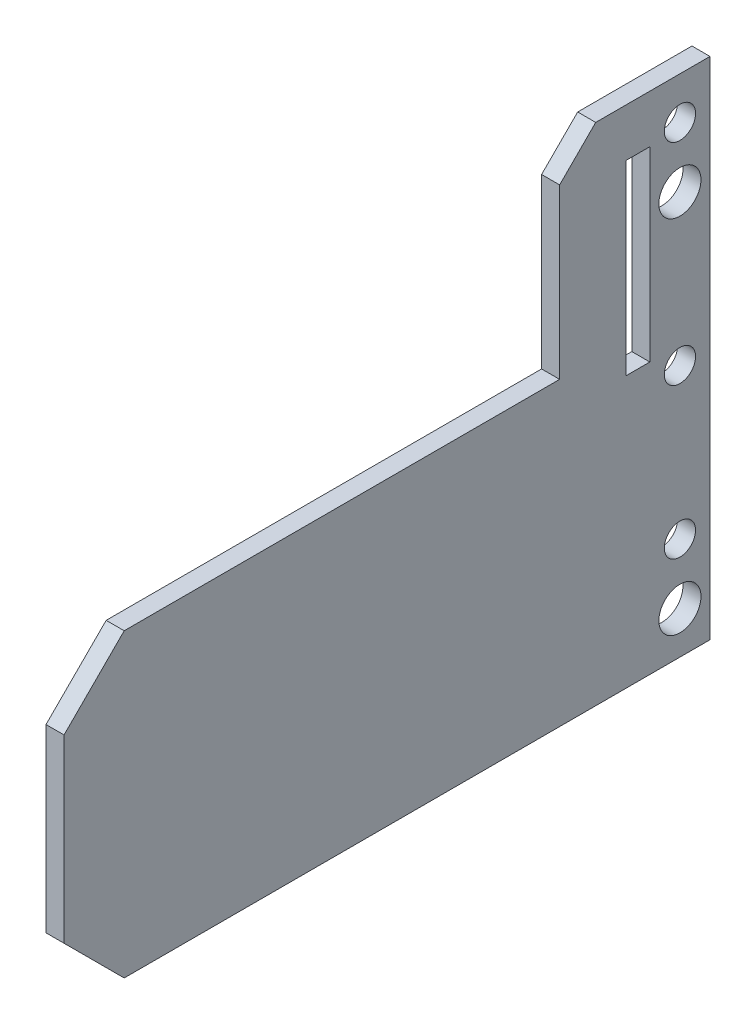
ISO-10303-21;
HEADER;
FILE_DESCRIPTION(('STEP AP214'),'2;1');
FILE_NAME('part.step','',(''),(''),'','','');
FILE_SCHEMA(('AUTOMOTIVE_DESIGN { 1 0 10303 214 1 1 1 1 }'));
ENDSEC;
DATA;
#1=APPLICATION_CONTEXT('core data for automotive mechanical design processes');
#2=APPLICATION_PROTOCOL_DEFINITION('international standard','automotive_design',2000,#1);
#3=PRODUCT_CONTEXT('',#1,'mechanical');
#4=PRODUCT('Part','Part','',(#3));
#5=PRODUCT_RELATED_PRODUCT_CATEGORY('part','',(#4));
#6=PRODUCT_DEFINITION_FORMATION('','',#4);
#7=PRODUCT_DEFINITION_CONTEXT('part definition',#1,'design');
#8=PRODUCT_DEFINITION('design','',#6,#7);
#9=PRODUCT_DEFINITION_SHAPE('','',#8);
#10=(LENGTH_UNIT() NAMED_UNIT(*) SI_UNIT(.MILLI.,.METRE.));
#11=(NAMED_UNIT(*) PLANE_ANGLE_UNIT() SI_UNIT($,.RADIAN.));
#12=(NAMED_UNIT(*) SI_UNIT($,.STERADIAN.) SOLID_ANGLE_UNIT());
#13=UNCERTAINTY_MEASURE_WITH_UNIT(LENGTH_MEASURE(1.E-05),#10,'distance_accuracy_value','');
#14=(GEOMETRIC_REPRESENTATION_CONTEXT(3) GLOBAL_UNCERTAINTY_ASSIGNED_CONTEXT((#13)) GLOBAL_UNIT_ASSIGNED_CONTEXT((#10,
#11,#12)) REPRESENTATION_CONTEXT('',''));
#15=CARTESIAN_POINT('',(0.,0.,0.));
#16=DIRECTION('',(0.,0.,1.));
#17=DIRECTION('',(1.,0.,0.));
#18=AXIS2_PLACEMENT_3D('',#15,#16,#17);
#19=CARTESIAN_POINT('',(1.5,-21.,-2.5000000000001));
#20=DIRECTION('',(-1.,0.,0.));
#21=DIRECTION('',(0.,0.,1.));
#22=AXIS2_PLACEMENT_3D('',#19,#20,#21);
#23=PLANE('',#22);
#24=DIRECTION('',(0.,0.,-1.));
#25=VECTOR('',#24,1.);
#26=CARTESIAN_POINT('',(1.5,17.,2.49999999999945));
#27=LINE('',#26,#25);
#28=CARTESIAN_POINT('',(1.5,17.,4.49999999999945));
#29=VERTEX_POINT('',#28);
#30=CARTESIAN_POINT('',(1.5,17.,2.49999999999945));
#31=VERTEX_POINT('',#30);
#32=EDGE_CURVE('E216',#29,#31,#27,.T.);
#33=ORIENTED_EDGE('',*,*,#32,.T.);
#34=DIRECTION('',(0.,-1.,0.));
#35=VECTOR('',#34,1.);
#36=CARTESIAN_POINT('',(1.5,17.,2.49999999999945));
#37=LINE('',#36,#35);
#38=CARTESIAN_POINT('',(1.5,1.5,2.49999999999945));
#39=VERTEX_POINT('',#38);
#40=EDGE_CURVE('E206',#31,#39,#37,.T.);
#41=ORIENTED_EDGE('',*,*,#40,.T.);
#42=DIRECTION('',(0.,0.,1.));
#43=VECTOR('',#42,1.);
#44=CARTESIAN_POINT('',(1.5,1.5,2.49999999999945));
#45=LINE('',#44,#43);
#46=CARTESIAN_POINT('',(1.5,1.5,4.49999999999945));
#47=VERTEX_POINT('',#46);
#48=EDGE_CURVE('E209',#39,#47,#45,.T.);
#49=ORIENTED_EDGE('',*,*,#48,.T.);
#50=DIRECTION('',(0.,1.,0.));
#51=VECTOR('',#50,1.);
#52=CARTESIAN_POINT('',(1.5,17.,4.49999999999945));
#53=LINE('',#52,#51);
#54=EDGE_CURVE('E213',#47,#29,#53,.T.);
#55=ORIENTED_EDGE('',*,*,#54,.T.);
#56=EDGE_LOOP('',(#33,#41,#49,#55));
#57=FACE_BOUND('',#56,.T.);
#58=CARTESIAN_POINT('',(1.5,17.4999999999999,0.));
#59=DIRECTION('',(1.,0.,0.));
#60=DIRECTION('',(0.,0.,-1.));
#61=AXIS2_PLACEMENT_3D('',#58,#59,#60);
#62=CIRCLE('',#61,1.29999994);
#63=CARTESIAN_POINT('',(1.5,17.4999999999999,-1.29999994));
#64=VERTEX_POINT('',#63);
#65=EDGE_CURVE('E229',#64,#64,#62,.T.);
#66=ORIENTED_EDGE('',*,*,#65,.F.);
#67=EDGE_LOOP('',(#66));
#68=FACE_BOUND('',#67,.T.);
#69=CARTESIAN_POINT('',(1.5,-12.5,0.));
#70=DIRECTION('',(1.,0.,0.));
#71=DIRECTION('',(0.,0.,-1.));
#72=AXIS2_PLACEMENT_3D('',#69,#70,#71);
#73=CIRCLE('',#72,1.29999994);
#74=CARTESIAN_POINT('',(1.5,-12.5,-1.29999994));
#75=VERTEX_POINT('',#74);
#76=EDGE_CURVE('E241',#75,#75,#73,.T.);
#77=ORIENTED_EDGE('',*,*,#76,.F.);
#78=EDGE_LOOP('',(#77));
#79=FACE_BOUND('',#78,.T.);
#80=CARTESIAN_POINT('',(1.5,0.,0.));
#81=DIRECTION('',(1.,0.,0.));
#82=DIRECTION('',(0.,0.,-1.));
#83=AXIS2_PLACEMENT_3D('',#80,#81,#82);
#84=CIRCLE('',#83,1.29999994);
#85=CARTESIAN_POINT('',(1.5,0.,-1.29999994));
#86=VERTEX_POINT('',#85);
#87=EDGE_CURVE('E247',#86,#86,#84,.T.);
#88=ORIENTED_EDGE('',*,*,#87,.F.);
#89=EDGE_LOOP('',(#88));
#90=FACE_BOUND('',#89,.T.);
#91=CARTESIAN_POINT('',(1.5,-17.5,0.));
#92=DIRECTION('',(1.,0.,0.));
#93=DIRECTION('',(0.,0.,-1.));
#94=AXIS2_PLACEMENT_3D('',#91,#92,#93);
#95=CIRCLE('',#94,1.74999999999946);
#96=CARTESIAN_POINT('',(1.5,-17.5,-1.74999999999945));
#97=VERTEX_POINT('',#96);
#98=EDGE_CURVE('E167',#97,#97,#95,.T.);
#99=ORIENTED_EDGE('',*,*,#98,.F.);
#100=EDGE_LOOP('',(#99));
#101=FACE_BOUND('',#100,.T.);
#102=DIRECTION('',(0.,-1.,0.));
#103=VECTOR('',#102,1.);
#104=CARTESIAN_POINT('',(1.5,21.,51.2));
#105=LINE('',#104,#103);
#106=CARTESIAN_POINT('',(1.5,-0.999999999999972,51.2));
#107=VERTEX_POINT('',#106);
#108=CARTESIAN_POINT('',(1.5,-16.,51.2));
#109=VERTEX_POINT('',#108);
#110=EDGE_CURVE('E159',#107,#109,#105,.T.);
#111=ORIENTED_EDGE('',*,*,#110,.T.);
#112=DIRECTION('',(0.,0.707106781186548,0.707106781186547));
#113=VECTOR('',#112,1.);
#114=CARTESIAN_POINT('',(1.5,-21.,46.2));
#115=LINE('',#114,#113);
#116=CARTESIAN_POINT('',(1.5,-21.,46.2));
#117=VERTEX_POINT('',#116);
#118=EDGE_CURVE('E127',#117,#109,#115,.T.);
#119=ORIENTED_EDGE('',*,*,#118,.F.);
#120=DIRECTION('',(0.,0.,-1.));
#121=VECTOR('',#120,1.);
#122=CARTESIAN_POINT('',(1.5,-21.,-2.5000000000001));
#123=LINE('',#122,#121);
#124=CARTESIAN_POINT('',(1.5,-21.,-2.5000000000001));
#125=VERTEX_POINT('',#124);
#126=EDGE_CURVE('E154',#117,#125,#123,.T.);
#127=ORIENTED_EDGE('',*,*,#126,.T.);
#128=DIRECTION('',(0.,1.,0.));
#129=VECTOR('',#128,1.);
#130=CARTESIAN_POINT('',(1.5,21.,-2.50000000000005));
#131=LINE('',#130,#129);
#132=CARTESIAN_POINT('',(1.5,21.,-2.50000000000005));
#133=VERTEX_POINT('',#132);
#134=EDGE_CURVE('E147',#125,#133,#131,.T.);
#135=ORIENTED_EDGE('',*,*,#134,.T.);
#136=DIRECTION('',(0.,0.,1.));
#137=VECTOR('',#136,1.);
#138=CARTESIAN_POINT('',(1.5,21.,-2.50000000000005));
#139=LINE('',#138,#137);
#140=CARTESIAN_POINT('',(1.5,21.,7.));
#141=VERTEX_POINT('',#140);
#142=EDGE_CURVE('E164',#133,#141,#139,.T.);
#143=ORIENTED_EDGE('',*,*,#142,.T.);
#144=DIRECTION('',(0.,0.707106781186544,-0.707106781186551));
#145=VECTOR('',#144,1.);
#146=CARTESIAN_POINT('',(1.5,18.0000000000001,10.));
#147=LINE('',#146,#145);
#148=CARTESIAN_POINT('',(1.5,18.0000000000001,10.));
#149=VERTEX_POINT('',#148);
#150=EDGE_CURVE('E185',#149,#141,#147,.T.);
#151=ORIENTED_EDGE('',*,*,#150,.F.);
#152=DIRECTION('',(0.,1.,0.));
#153=VECTOR('',#152,1.);
#154=CARTESIAN_POINT('',(1.5,4.00000000000003,10.));
#155=LINE('',#154,#153);
#156=CARTESIAN_POINT('',(1.5,4.00000000000003,10.));
#157=VERTEX_POINT('',#156);
#158=EDGE_CURVE('E473',#157,#149,#155,.T.);
#159=ORIENTED_EDGE('',*,*,#158,.F.);
#160=DIRECTION('',(0.,0.,-1.));
#161=VECTOR('',#160,1.);
#162=CARTESIAN_POINT('',(1.5,4.00000000000003,46.2));
#163=LINE('',#162,#161);
#164=CARTESIAN_POINT('',(1.5,4.00000000000003,46.2));
#165=VERTEX_POINT('',#164);
#166=EDGE_CURVE('E470',#165,#157,#163,.T.);
#167=ORIENTED_EDGE('',*,*,#166,.F.);
#168=DIRECTION('',(0.,0.707106781186548,-0.707106781186547));
#169=VECTOR('',#168,1.);
#170=CARTESIAN_POINT('',(1.5,4.00000000000003,46.2));
#171=LINE('',#170,#169);
#172=EDGE_CURVE('E467',#107,#165,#171,.T.);
#173=ORIENTED_EDGE('',*,*,#172,.F.);
#174=EDGE_LOOP('',(#111,#119,#127,#135,#143,#151,#159,#167,#173));
#175=FACE_BOUND('',#174,.T.);
#176=CARTESIAN_POINT('',(1.5,12.5,2.95125035520982E-13));
#177=DIRECTION('',(1.,0.,0.));
#178=DIRECTION('',(0.,0.,-1.));
#179=AXIS2_PLACEMENT_3D('',#176,#177,#178);
#180=CIRCLE('',#179,1.75);
#181=CARTESIAN_POINT('',(1.5,12.5,-1.7499999999997));
#182=VERTEX_POINT('',#181);
#183=EDGE_CURVE('E175',#182,#182,#180,.T.);
#184=ORIENTED_EDGE('',*,*,#183,.F.);
#185=EDGE_LOOP('',(#184));
#186=FACE_BOUND('',#185,.T.);
#187=ADVANCED_FACE('F30',(#57,#68,#79,#90,#101,#175,#186),#23,.F.);
#188=CARTESIAN_POINT('',(0.,-21.,-2.5000000000001));
#189=DIRECTION('',(-1.,0.,0.));
#190=DIRECTION('',(0.,0.,1.));
#191=AXIS2_PLACEMENT_3D('',#188,#189,#190);
#192=PLANE('',#191);
#193=DIRECTION('',(0.,0.707106781186548,0.707106781186547));
#194=VECTOR('',#193,1.);
#195=CARTESIAN_POINT('',(0.,-21.,46.2));
#196=LINE('',#195,#194);
#197=CARTESIAN_POINT('',(0.,-21.,46.2));
#198=VERTEX_POINT('',#197);
#199=CARTESIAN_POINT('',(0.,-16.,51.2));
#200=VERTEX_POINT('',#199);
#201=EDGE_CURVE('E45',#198,#200,#196,.T.);
#202=ORIENTED_EDGE('',*,*,#201,.T.);
#203=DIRECTION('',(0.,-1.,0.));
#204=VECTOR('',#203,1.);
#205=CARTESIAN_POINT('',(0.,21.,51.2));
#206=LINE('',#205,#204);
#207=CARTESIAN_POINT('',(0.,-0.99999999999997,51.2));
#208=VERTEX_POINT('',#207);
#209=EDGE_CURVE('E139',#208,#200,#206,.T.);
#210=ORIENTED_EDGE('',*,*,#209,.F.);
#211=DIRECTION('',(0.,0.707106781186548,-0.707106781186547));
#212=VECTOR('',#211,1.);
#213=CARTESIAN_POINT('',(0.,4.00000000000003,46.2));
#214=LINE('',#213,#212);
#215=CARTESIAN_POINT('',(0.,4.00000000000003,46.2));
#216=VERTEX_POINT('',#215);
#217=EDGE_CURVE('E53',#208,#216,#214,.T.);
#218=ORIENTED_EDGE('',*,*,#217,.T.);
#219=DIRECTION('',(0.,0.,-1.));
#220=VECTOR('',#219,1.);
#221=CARTESIAN_POINT('',(0.,4.00000000000003,46.2));
#222=LINE('',#221,#220);
#223=CARTESIAN_POINT('',(0.,4.00000000000003,10.));
#224=VERTEX_POINT('',#223);
#225=EDGE_CURVE('E483',#216,#224,#222,.T.);
#226=ORIENTED_EDGE('',*,*,#225,.T.);
#227=DIRECTION('',(0.,1.,0.));
#228=VECTOR('',#227,1.);
#229=CARTESIAN_POINT('',(0.,4.00000000000003,10.));
#230=LINE('',#229,#228);
#231=CARTESIAN_POINT('',(0.,18.0000000000001,10.));
#232=VERTEX_POINT('',#231);
#233=EDGE_CURVE('E475',#224,#232,#230,.T.);
#234=ORIENTED_EDGE('',*,*,#233,.T.);
#235=DIRECTION('',(0.,0.707106781186544,-0.707106781186551));
#236=VECTOR('',#235,1.);
#237=CARTESIAN_POINT('',(0.,18.0000000000001,10.));
#238=LINE('',#237,#236);
#239=CARTESIAN_POINT('',(0.,21.,7.));
#240=VERTEX_POINT('',#239);
#241=EDGE_CURVE('E471',#232,#240,#238,.T.);
#242=ORIENTED_EDGE('',*,*,#241,.T.);
#243=DIRECTION('',(0.,0.,1.));
#244=VECTOR('',#243,1.);
#245=CARTESIAN_POINT('',(0.,21.,-2.50000000000005));
#246=LINE('',#245,#244);
#247=CARTESIAN_POINT('',(0.,21.,-2.50000000000005));
#248=VERTEX_POINT('',#247);
#249=EDGE_CURVE('E145',#248,#240,#246,.T.);
#250=ORIENTED_EDGE('',*,*,#249,.F.);
#251=DIRECTION('',(0.,1.,0.));
#252=VECTOR('',#251,1.);
#253=CARTESIAN_POINT('',(0.,21.,-2.50000000000005));
#254=LINE('',#253,#252);
#255=CARTESIAN_POINT('',(0.,-21.,-2.5000000000001));
#256=VERTEX_POINT('',#255);
#257=EDGE_CURVE('E150',#256,#248,#254,.T.);
#258=ORIENTED_EDGE('',*,*,#257,.F.);
#259=DIRECTION('',(0.,0.,-1.));
#260=VECTOR('',#259,1.);
#261=CARTESIAN_POINT('',(0.,-21.,-2.5000000000001));
#262=LINE('',#261,#260);
#263=EDGE_CURVE('E141',#198,#256,#262,.T.);
#264=ORIENTED_EDGE('',*,*,#263,.F.);
#265=EDGE_LOOP('',(#202,#210,#218,#226,#234,#242,#250,#258,#264));
#266=FACE_BOUND('',#265,.T.);
#267=DIRECTION('',(0.,-1.,0.));
#268=VECTOR('',#267,1.);
#269=CARTESIAN_POINT('',(0.,17.,2.49999999999945));
#270=LINE('',#269,#268);
#271=CARTESIAN_POINT('',(0.,17.,2.49999999999945));
#272=VERTEX_POINT('',#271);
#273=CARTESIAN_POINT('',(0.,1.5,2.49999999999945));
#274=VERTEX_POINT('',#273);
#275=EDGE_CURVE('E192',#272,#274,#270,.T.);
#276=ORIENTED_EDGE('',*,*,#275,.F.);
#277=DIRECTION('',(0.,0.,-1.));
#278=VECTOR('',#277,1.);
#279=CARTESIAN_POINT('',(0.,17.,2.49999999999945));
#280=LINE('',#279,#278);
#281=CARTESIAN_POINT('',(0.,17.,4.49999999999945));
#282=VERTEX_POINT('',#281);
#283=EDGE_CURVE('E210',#282,#272,#280,.T.);
#284=ORIENTED_EDGE('',*,*,#283,.F.);
#285=DIRECTION('',(0.,1.,0.));
#286=VECTOR('',#285,1.);
#287=CARTESIAN_POINT('',(0.,17.,4.49999999999945));
#288=LINE('',#287,#286);
#289=CARTESIAN_POINT('',(0.,1.5,4.49999999999945));
#290=VERTEX_POINT('',#289);
#291=EDGE_CURVE('E222',#290,#282,#288,.T.);
#292=ORIENTED_EDGE('',*,*,#291,.F.);
#293=DIRECTION('',(0.,0.,1.));
#294=VECTOR('',#293,1.);
#295=CARTESIAN_POINT('',(0.,1.5,2.49999999999945));
#296=LINE('',#295,#294);
#297=EDGE_CURVE('E195',#274,#290,#296,.T.);
#298=ORIENTED_EDGE('',*,*,#297,.F.);
#299=EDGE_LOOP('',(#276,#284,#292,#298));
#300=FACE_BOUND('',#299,.T.);
#301=CARTESIAN_POINT('',(0.,17.4999999999999,0.));
#302=DIRECTION('',(1.,0.,0.));
#303=DIRECTION('',(0.,0.,-1.));
#304=AXIS2_PLACEMENT_3D('',#301,#302,#303);
#305=CIRCLE('',#304,1.29999994);
#306=CARTESIAN_POINT('',(0.,17.4999999999999,-1.29999994));
#307=VERTEX_POINT('',#306);
#308=EDGE_CURVE('E238',#307,#307,#305,.T.);
#309=ORIENTED_EDGE('',*,*,#308,.T.);
#310=EDGE_LOOP('',(#309));
#311=FACE_BOUND('',#310,.T.);
#312=CARTESIAN_POINT('',(0.,-12.5,0.));
#313=DIRECTION('',(1.,0.,0.));
#314=DIRECTION('',(0.,0.,-1.));
#315=AXIS2_PLACEMENT_3D('',#312,#313,#314);
#316=CIRCLE('',#315,1.29999994);
#317=CARTESIAN_POINT('',(0.,-12.5,-1.29999994));
#318=VERTEX_POINT('',#317);
#319=EDGE_CURVE('E244',#318,#318,#316,.T.);
#320=ORIENTED_EDGE('',*,*,#319,.T.);
#321=EDGE_LOOP('',(#320));
#322=FACE_BOUND('',#321,.T.);
#323=CARTESIAN_POINT('',(0.,0.,0.));
#324=DIRECTION('',(1.,0.,0.));
#325=DIRECTION('',(0.,0.,-1.));
#326=AXIS2_PLACEMENT_3D('',#323,#324,#325);
#327=CIRCLE('',#326,1.29999994);
#328=CARTESIAN_POINT('',(0.,0.,-1.29999994));
#329=VERTEX_POINT('',#328);
#330=EDGE_CURVE('E250',#329,#329,#327,.T.);
#331=ORIENTED_EDGE('',*,*,#330,.T.);
#332=EDGE_LOOP('',(#331));
#333=FACE_BOUND('',#332,.T.);
#334=CARTESIAN_POINT('',(0.,-17.5,0.));
#335=DIRECTION('',(1.,0.,0.));
#336=DIRECTION('',(0.,0.,-1.));
#337=AXIS2_PLACEMENT_3D('',#334,#335,#336);
#338=CIRCLE('',#337,1.74999999999946);
#339=CARTESIAN_POINT('',(0.,-17.5,-1.74999999999945));
#340=VERTEX_POINT('',#339);
#341=EDGE_CURVE('E170',#340,#340,#338,.T.);
#342=ORIENTED_EDGE('',*,*,#341,.T.);
#343=EDGE_LOOP('',(#342));
#344=FACE_BOUND('',#343,.T.);
#345=CARTESIAN_POINT('',(0.,12.5,2.95125035520982E-13));
#346=DIRECTION('',(1.,0.,0.));
#347=DIRECTION('',(0.,0.,-1.));
#348=AXIS2_PLACEMENT_3D('',#345,#346,#347);
#349=CIRCLE('',#348,1.75);
#350=CARTESIAN_POINT('',(0.,12.5,-1.7499999999997));
#351=VERTEX_POINT('',#350);
#352=EDGE_CURVE('E178',#351,#351,#349,.T.);
#353=ORIENTED_EDGE('',*,*,#352,.T.);
#354=EDGE_LOOP('',(#353));
#355=FACE_BOUND('',#354,.T.);
#356=ADVANCED_FACE('F137',(#266,#300,#311,#322,#333,#344,#355),#192,.T.);
#357=CARTESIAN_POINT('',(1.5,21.,-2.50000000000005));
#358=DIRECTION('',(0.,0.,1.));
#359=DIRECTION('',(0.,-1.,0.));
#360=AXIS2_PLACEMENT_3D('',#357,#358,#359);
#361=PLANE('',#360);
#362=ORIENTED_EDGE('',*,*,#257,.T.);
#363=DIRECTION('',(-1.,0.,0.));
#364=VECTOR('',#363,1.);
#365=CARTESIAN_POINT('',(1.5,21.,-2.50000000000005));
#366=LINE('',#365,#364);
#367=EDGE_CURVE('E11',#133,#248,#366,.T.);
#368=ORIENTED_EDGE('',*,*,#367,.F.);
#369=ORIENTED_EDGE('',*,*,#134,.F.);
#370=DIRECTION('',(-1.,0.,0.));
#371=VECTOR('',#370,1.);
#372=CARTESIAN_POINT('',(1.5,-21.,-2.5000000000001));
#373=LINE('',#372,#371);
#374=EDGE_CURVE('E38',#125,#256,#373,.T.);
#375=ORIENTED_EDGE('',*,*,#374,.T.);
#376=EDGE_LOOP('',(#362,#368,#369,#375));
#377=FACE_BOUND('',#376,.T.);
#378=ADVANCED_FACE('F32',(#377),#361,.F.);
#379=CARTESIAN_POINT('',(1.5,21.,-2.50000000000005));
#380=DIRECTION('',(0.,-1.,0.));
#381=DIRECTION('',(0.,0.,-1.));
#382=AXIS2_PLACEMENT_3D('',#379,#380,#381);
#383=PLANE('',#382);
#384=ORIENTED_EDGE('',*,*,#249,.T.);
#385=DIRECTION('',(1.,0.,0.));
#386=VECTOR('',#385,1.);
#387=CARTESIAN_POINT('',(-0.000999999999999916,21.,7.));
#388=LINE('',#387,#386);
#389=EDGE_CURVE('E189',#240,#141,#388,.T.);
#390=ORIENTED_EDGE('',*,*,#389,.T.);
#391=ORIENTED_EDGE('',*,*,#142,.F.);
#392=ORIENTED_EDGE('',*,*,#367,.T.);
#393=EDGE_LOOP('',(#384,#390,#391,#392));
#394=FACE_BOUND('',#393,.T.);
#395=ADVANCED_FACE('F188',(#394),#383,.F.);
#396=CARTESIAN_POINT('',(1.5,21.,51.2));
#397=DIRECTION('',(0.,0.,-1.));
#398=DIRECTION('',(0.,1.,0.));
#399=AXIS2_PLACEMENT_3D('',#396,#397,#398);
#400=PLANE('',#399);
#401=ORIENTED_EDGE('',*,*,#209,.T.);
#402=DIRECTION('',(1.,0.,0.));
#403=VECTOR('',#402,1.);
#404=CARTESIAN_POINT('',(-0.000999999999999916,-16.,51.2));
#405=LINE('',#404,#403);
#406=EDGE_CURVE('E124',#200,#109,#405,.T.);
#407=ORIENTED_EDGE('',*,*,#406,.T.);
#408=ORIENTED_EDGE('',*,*,#110,.F.);
#409=DIRECTION('',(1.,0.,0.));
#410=VECTOR('',#409,1.);
#411=CARTESIAN_POINT('',(-0.000999999999999916,-0.999999999999972,51.2));
#412=LINE('',#411,#410);
#413=EDGE_CURVE('E144',#208,#107,#412,.T.);
#414=ORIENTED_EDGE('',*,*,#413,.F.);
#415=EDGE_LOOP('',(#401,#407,#408,#414));
#416=FACE_BOUND('',#415,.T.);
#417=ADVANCED_FACE('F143',(#416),#400,.F.);
#418=CARTESIAN_POINT('',(1.5,-21.,-2.5000000000001));
#419=DIRECTION('',(0.,1.,0.));
#420=DIRECTION('',(0.,0.,1.));
#421=AXIS2_PLACEMENT_3D('',#418,#419,#420);
#422=PLANE('',#421);
#423=ORIENTED_EDGE('',*,*,#126,.F.);
#424=DIRECTION('',(1.,0.,0.));
#425=VECTOR('',#424,1.);
#426=CARTESIAN_POINT('',(-0.000999999999999916,-21.,46.2));
#427=LINE('',#426,#425);
#428=EDGE_CURVE('E132',#198,#117,#427,.T.);
#429=ORIENTED_EDGE('',*,*,#428,.F.);
#430=ORIENTED_EDGE('',*,*,#263,.T.);
#431=ORIENTED_EDGE('',*,*,#374,.F.);
#432=EDGE_LOOP('',(#423,#429,#430,#431));
#433=FACE_BOUND('',#432,.T.);
#434=ADVANCED_FACE('F271',(#433),#422,.F.);
#435=CARTESIAN_POINT('',(1.5,-17.5,0.));
#436=DIRECTION('',(-1.,0.,0.));
#437=DIRECTION('',(0.,0.,1.));
#438=AXIS2_PLACEMENT_3D('',#435,#436,#437);
#439=CYLINDRICAL_SURFACE('',#438,1.74999999999946);
#440=ORIENTED_EDGE('',*,*,#98,.T.);
#441=EDGE_LOOP('',(#440));
#442=FACE_BOUND('',#441,.T.);
#443=ORIENTED_EDGE('',*,*,#341,.F.);
#444=EDGE_LOOP('',(#443));
#445=FACE_BOUND('',#444,.T.);
#446=ADVANCED_FACE('F262',(#442,#445),#439,.F.);
#447=CARTESIAN_POINT('',(1.5,12.5,2.95125035520982E-13));
#448=DIRECTION('',(-1.,0.,0.));
#449=DIRECTION('',(0.,0.,1.));
#450=AXIS2_PLACEMENT_3D('',#447,#448,#449);
#451=CYLINDRICAL_SURFACE('',#450,1.75);
#452=ORIENTED_EDGE('',*,*,#183,.T.);
#453=EDGE_LOOP('',(#452));
#454=FACE_BOUND('',#453,.T.);
#455=ORIENTED_EDGE('',*,*,#352,.F.);
#456=EDGE_LOOP('',(#455));
#457=FACE_BOUND('',#456,.T.);
#458=ADVANCED_FACE('F259',(#454,#457),#451,.F.);
#459=CARTESIAN_POINT('',(1.5,0.,0.));
#460=DIRECTION('',(1.,0.,0.));
#461=DIRECTION('',(0.,0.,-1.));
#462=AXIS2_PLACEMENT_3D('',#459,#460,#461);
#463=CYLINDRICAL_SURFACE('',#462,1.29999994);
#464=ORIENTED_EDGE('',*,*,#330,.F.);
#465=EDGE_LOOP('',(#464));
#466=FACE_BOUND('',#465,.T.);
#467=ORIENTED_EDGE('',*,*,#87,.T.);
#468=EDGE_LOOP('',(#467));
#469=FACE_BOUND('',#468,.T.);
#470=ADVANCED_FACE('F261',(#466,#469),#463,.F.);
#471=CARTESIAN_POINT('',(1.5,-12.5,0.));
#472=DIRECTION('',(1.,0.,0.));
#473=DIRECTION('',(0.,0.,-1.));
#474=AXIS2_PLACEMENT_3D('',#471,#472,#473);
#475=CYLINDRICAL_SURFACE('',#474,1.29999994);
#476=ORIENTED_EDGE('',*,*,#319,.F.);
#477=EDGE_LOOP('',(#476));
#478=FACE_BOUND('',#477,.T.);
#479=ORIENTED_EDGE('',*,*,#76,.T.);
#480=EDGE_LOOP('',(#479));
#481=FACE_BOUND('',#480,.T.);
#482=ADVANCED_FACE('F268',(#478,#481),#475,.F.);
#483=CARTESIAN_POINT('',(1.5,17.4999999999999,0.));
#484=DIRECTION('',(1.,0.,0.));
#485=DIRECTION('',(0.,0.,-1.));
#486=AXIS2_PLACEMENT_3D('',#483,#484,#485);
#487=CYLINDRICAL_SURFACE('',#486,1.29999994);
#488=ORIENTED_EDGE('',*,*,#308,.F.);
#489=EDGE_LOOP('',(#488));
#490=FACE_BOUND('',#489,.T.);
#491=ORIENTED_EDGE('',*,*,#65,.T.);
#492=EDGE_LOOP('',(#491));
#493=FACE_BOUND('',#492,.T.);
#494=ADVANCED_FACE('F384',(#490,#493),#487,.F.);
#495=CARTESIAN_POINT('',(1.5,17.,2.49999999999945));
#496=DIRECTION('',(0.,0.,-1.));
#497=DIRECTION('',(0.,1.,0.));
#498=AXIS2_PLACEMENT_3D('',#495,#496,#497);
#499=PLANE('',#498);
#500=ORIENTED_EDGE('',*,*,#275,.T.);
#501=DIRECTION('',(-1.,0.,0.));
#502=VECTOR('',#501,1.);
#503=CARTESIAN_POINT('',(1.5,1.5,2.49999999999945));
#504=LINE('',#503,#502);
#505=EDGE_CURVE('E218',#39,#274,#504,.T.);
#506=ORIENTED_EDGE('',*,*,#505,.F.);
#507=ORIENTED_EDGE('',*,*,#40,.F.);
#508=DIRECTION('',(-1.,0.,0.));
#509=VECTOR('',#508,1.);
#510=CARTESIAN_POINT('',(1.5,17.,2.49999999999945));
#511=LINE('',#510,#509);
#512=EDGE_CURVE('E227',#31,#272,#511,.T.);
#513=ORIENTED_EDGE('',*,*,#512,.T.);
#514=EDGE_LOOP('',(#500,#506,#507,#513));
#515=FACE_BOUND('',#514,.T.);
#516=ADVANCED_FACE('F375',(#515),#499,.F.);
#517=CARTESIAN_POINT('',(1.5,17.,2.49999999999945));
#518=DIRECTION('',(0.,1.,0.));
#519=DIRECTION('',(0.,0.,1.));
#520=AXIS2_PLACEMENT_3D('',#517,#518,#519);
#521=PLANE('',#520);
#522=ORIENTED_EDGE('',*,*,#283,.T.);
#523=ORIENTED_EDGE('',*,*,#512,.F.);
#524=ORIENTED_EDGE('',*,*,#32,.F.);
#525=DIRECTION('',(-1.,0.,0.));
#526=VECTOR('',#525,1.);
#527=CARTESIAN_POINT('',(1.5,17.,4.49999999999945));
#528=LINE('',#527,#526);
#529=EDGE_CURVE('E230',#29,#282,#528,.T.);
#530=ORIENTED_EDGE('',*,*,#529,.T.);
#531=EDGE_LOOP('',(#522,#523,#524,#530));
#532=FACE_BOUND('',#531,.T.);
#533=ADVANCED_FACE('F371',(#532),#521,.F.);
#534=CARTESIAN_POINT('',(1.5,17.,4.49999999999945));
#535=DIRECTION('',(0.,0.,1.));
#536=DIRECTION('',(0.,-1.,0.));
#537=AXIS2_PLACEMENT_3D('',#534,#535,#536);
#538=PLANE('',#537);
#539=ORIENTED_EDGE('',*,*,#291,.T.);
#540=ORIENTED_EDGE('',*,*,#529,.F.);
#541=ORIENTED_EDGE('',*,*,#54,.F.);
#542=DIRECTION('',(-1.,0.,0.));
#543=VECTOR('',#542,1.);
#544=CARTESIAN_POINT('',(1.5,1.5,4.49999999999945));
#545=LINE('',#544,#543);
#546=EDGE_CURVE('E232',#47,#290,#545,.T.);
#547=ORIENTED_EDGE('',*,*,#546,.T.);
#548=EDGE_LOOP('',(#539,#540,#541,#547));
#549=FACE_BOUND('',#548,.T.);
#550=ADVANCED_FACE('F374',(#549),#538,.F.);
#551=CARTESIAN_POINT('',(1.5,1.5,2.49999999999945));
#552=DIRECTION('',(0.,-1.,0.));
#553=DIRECTION('',(0.,0.,-1.));
#554=AXIS2_PLACEMENT_3D('',#551,#552,#553);
#555=PLANE('',#554);
#556=ORIENTED_EDGE('',*,*,#297,.T.);
#557=ORIENTED_EDGE('',*,*,#546,.F.);
#558=ORIENTED_EDGE('',*,*,#48,.F.);
#559=ORIENTED_EDGE('',*,*,#505,.T.);
#560=EDGE_LOOP('',(#556,#557,#558,#559));
#561=FACE_BOUND('',#560,.T.);
#562=ADVANCED_FACE('F328',(#561),#555,.F.);
#563=CARTESIAN_POINT('',(-0.000999999999999916,18.0000000000001,10.));
#564=DIRECTION('',(0.,-0.707106781186551,-0.707106781186544));
#565=DIRECTION('',(0.,0.707106781186544,-0.707106781186551));
#566=AXIS2_PLACEMENT_3D('',#563,#564,#565);
#567=PLANE('',#566);
#568=DIRECTION('',(1.,0.,0.));
#569=VECTOR('',#568,1.);
#570=CARTESIAN_POINT('',(-0.000999999999999916,18.0000000000001,10.));
#571=LINE('',#570,#569);
#572=EDGE_CURVE('E193',#232,#149,#571,.T.);
#573=ORIENTED_EDGE('',*,*,#572,.T.);
#574=ORIENTED_EDGE('',*,*,#150,.T.);
#575=ORIENTED_EDGE('',*,*,#389,.F.);
#576=ORIENTED_EDGE('',*,*,#241,.F.);
#577=EDGE_LOOP('',(#573,#574,#575,#576));
#578=FACE_BOUND('',#577,.T.);
#579=ADVANCED_FACE('F322',(#578),#567,.F.);
#580=CARTESIAN_POINT('',(-0.000999999999999916,4.00000000000003,10.));
#581=DIRECTION('',(0.,0.,-1.));
#582=DIRECTION('',(0.,1.,0.));
#583=AXIS2_PLACEMENT_3D('',#580,#581,#582);
#584=PLANE('',#583);
#585=DIRECTION('',(1.,0.,0.));
#586=VECTOR('',#585,1.);
#587=CARTESIAN_POINT('',(-0.000999999999999916,4.00000000000003,10.));
#588=LINE('',#587,#586);
#589=EDGE_CURVE('E197',#224,#157,#588,.T.);
#590=ORIENTED_EDGE('',*,*,#589,.T.);
#591=ORIENTED_EDGE('',*,*,#158,.T.);
#592=ORIENTED_EDGE('',*,*,#572,.F.);
#593=ORIENTED_EDGE('',*,*,#233,.F.);
#594=EDGE_LOOP('',(#590,#591,#592,#593));
#595=FACE_BOUND('',#594,.T.);
#596=ADVANCED_FACE('F327',(#595),#584,.F.);
#597=CARTESIAN_POINT('',(-0.000999999999999916,4.00000000000003,46.2));
#598=DIRECTION('',(0.,-1.,0.));
#599=DIRECTION('',(0.,0.,-1.));
#600=AXIS2_PLACEMENT_3D('',#597,#598,#599);
#601=PLANE('',#600);
#602=DIRECTION('',(1.,0.,0.));
#603=VECTOR('',#602,1.);
#604=CARTESIAN_POINT('',(-0.000999999999999916,4.00000000000003,46.2));
#605=LINE('',#604,#603);
#606=EDGE_CURVE('E203',#216,#165,#605,.T.);
#607=ORIENTED_EDGE('',*,*,#606,.T.);
#608=ORIENTED_EDGE('',*,*,#166,.T.);
#609=ORIENTED_EDGE('',*,*,#589,.F.);
#610=ORIENTED_EDGE('',*,*,#225,.F.);
#611=EDGE_LOOP('',(#607,#608,#609,#610));
#612=FACE_BOUND('',#611,.T.);
#613=ADVANCED_FACE('F339',(#612),#601,.F.);
#614=CARTESIAN_POINT('',(-0.000999999999999916,4.00000000000003,46.2));
#615=DIRECTION('',(0.,-0.707106781186547,-0.707106781186548));
#616=DIRECTION('',(0.,0.707106781186548,-0.707106781186547));
#617=AXIS2_PLACEMENT_3D('',#614,#615,#616);
#618=PLANE('',#617);
#619=ORIENTED_EDGE('',*,*,#413,.T.);
#620=ORIENTED_EDGE('',*,*,#172,.T.);
#621=ORIENTED_EDGE('',*,*,#606,.F.);
#622=ORIENTED_EDGE('',*,*,#217,.F.);
#623=EDGE_LOOP('',(#619,#620,#621,#622));
#624=FACE_BOUND('',#623,.T.);
#625=ADVANCED_FACE('F349',(#624),#618,.F.);
#626=CARTESIAN_POINT('',(-0.000999999999999916,-21.,46.2));
#627=DIRECTION('',(0.,0.707106781186547,-0.707106781186548));
#628=DIRECTION('',(0.,0.707106781186548,0.707106781186547));
#629=AXIS2_PLACEMENT_3D('',#626,#627,#628);
#630=PLANE('',#629);
#631=ORIENTED_EDGE('',*,*,#428,.T.);
#632=ORIENTED_EDGE('',*,*,#118,.T.);
#633=ORIENTED_EDGE('',*,*,#406,.F.);
#634=ORIENTED_EDGE('',*,*,#201,.F.);
#635=EDGE_LOOP('',(#631,#632,#633,#634));
#636=FACE_BOUND('',#635,.T.);
#637=ADVANCED_FACE('F125',(#636),#630,.F.);
#638=CLOSED_SHELL('',(#187,#356,#378,#395,#417,#434,#446,#458,#470,#482,#494,#516,#533,#550,
#562,#579,#596,#613,#625,#637));
#639=MANIFOLD_SOLID_BREP('B2',#638);
#640=ADVANCED_BREP_SHAPE_REPRESENTATION('',(#18,#639),#14);
#641=SHAPE_DEFINITION_REPRESENTATION(#9,#640);
ENDSEC;
END-ISO-10303-21;
